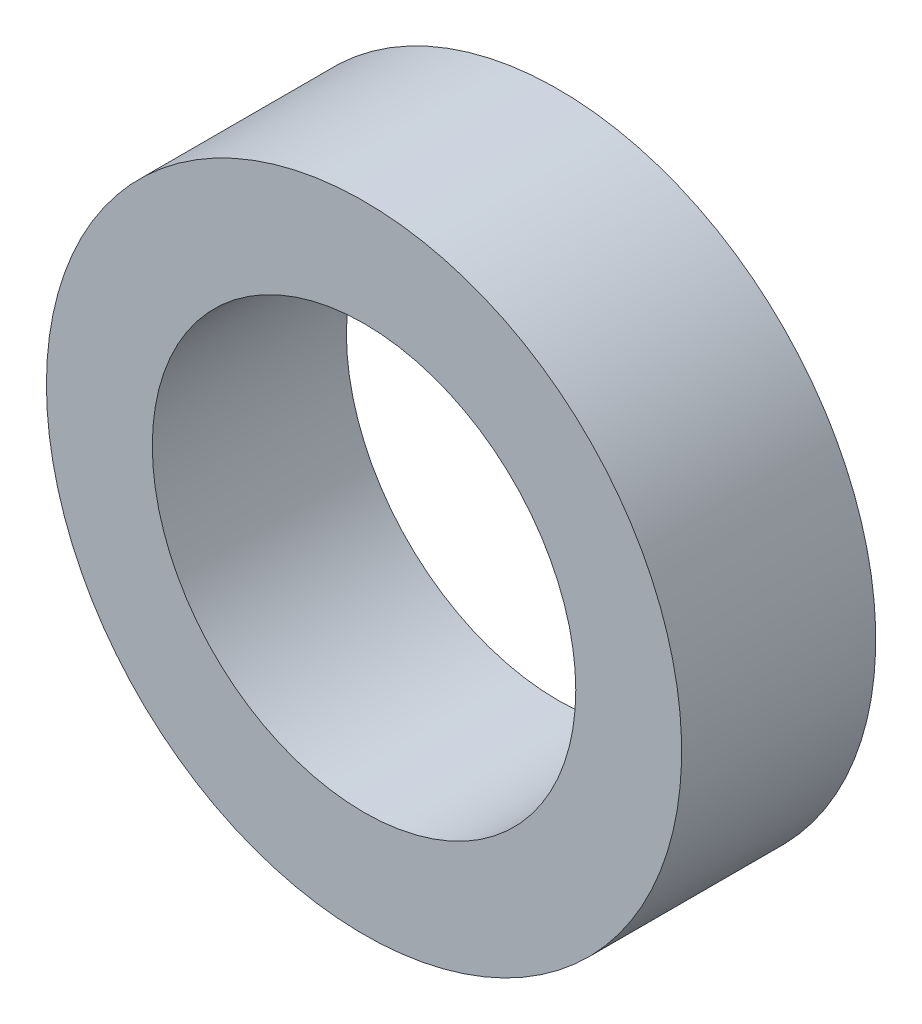
ISO-10303-21;
HEADER;
FILE_DESCRIPTION(('STEP AP214'),'2;1');
FILE_NAME('part.step','',(''),(''),'','','');
FILE_SCHEMA(('AUTOMOTIVE_DESIGN { 1 0 10303 214 1 1 1 1 }'));
ENDSEC;
DATA;
#1=APPLICATION_CONTEXT('core data for automotive mechanical design processes');
#2=APPLICATION_PROTOCOL_DEFINITION('international standard','automotive_design',2000,#1);
#3=PRODUCT_CONTEXT('',#1,'mechanical');
#4=PRODUCT('Part','Part','',(#3));
#5=PRODUCT_RELATED_PRODUCT_CATEGORY('part','',(#4));
#6=PRODUCT_DEFINITION_FORMATION('','',#4);
#7=PRODUCT_DEFINITION_CONTEXT('part definition',#1,'design');
#8=PRODUCT_DEFINITION('design','',#6,#7);
#9=PRODUCT_DEFINITION_SHAPE('','',#8);
#10=(LENGTH_UNIT() NAMED_UNIT(*) SI_UNIT(.MILLI.,.METRE.));
#11=(NAMED_UNIT(*) PLANE_ANGLE_UNIT() SI_UNIT($,.RADIAN.));
#12=(NAMED_UNIT(*) SI_UNIT($,.STERADIAN.) SOLID_ANGLE_UNIT());
#13=UNCERTAINTY_MEASURE_WITH_UNIT(LENGTH_MEASURE(1.E-05),#10,'distance_accuracy_value','');
#14=(GEOMETRIC_REPRESENTATION_CONTEXT(3) GLOBAL_UNCERTAINTY_ASSIGNED_CONTEXT((#13)) GLOBAL_UNIT_ASSIGNED_CONTEXT((#10,
#11,#12)) REPRESENTATION_CONTEXT('',''));
#15=CARTESIAN_POINT('',(0.,0.,0.));
#16=DIRECTION('',(0.,0.,1.));
#17=DIRECTION('',(1.,0.,0.));
#18=AXIS2_PLACEMENT_3D('',#15,#16,#17);
#19=CARTESIAN_POINT('',(0.,0.,5.5));
#20=DIRECTION('',(0.,0.,-1.));
#21=DIRECTION('',(-1.,0.,0.));
#22=AXIS2_PLACEMENT_3D('',#19,#20,#21);
#23=CYLINDRICAL_SURFACE('',#22,6.);
#24=CARTESIAN_POINT('',(0.,0.,0.));
#25=DIRECTION('',(0.,0.,-1.));
#26=DIRECTION('',(-1.,0.,0.));
#27=AXIS2_PLACEMENT_3D('',#24,#25,#26);
#28=CIRCLE('',#27,6.);
#29=CARTESIAN_POINT('',(-6.,0.,0.));
#30=VERTEX_POINT('',#29);
#31=EDGE_CURVE('E27',#30,#30,#28,.T.);
#32=ORIENTED_EDGE('',*,*,#31,.T.);
#33=EDGE_LOOP('',(#32));
#34=FACE_BOUND('',#33,.T.);
#35=CARTESIAN_POINT('',(0.,0.,5.5));
#36=DIRECTION('',(0.,0.,-1.));
#37=DIRECTION('',(-1.,0.,0.));
#38=AXIS2_PLACEMENT_3D('',#35,#36,#37);
#39=CIRCLE('',#38,6.);
#40=CARTESIAN_POINT('',(-6.,0.,5.5));
#41=VERTEX_POINT('',#40);
#42=EDGE_CURVE('E18',#41,#41,#39,.T.);
#43=ORIENTED_EDGE('',*,*,#42,.F.);
#44=EDGE_LOOP('',(#43));
#45=FACE_BOUND('',#44,.T.);
#46=ADVANCED_FACE('F15',(#34,#45),#23,.F.);
#47=CARTESIAN_POINT('',(0.,0.,5.5));
#48=DIRECTION('',(0.,0.,1.));
#49=DIRECTION('',(1.,0.,0.));
#50=AXIS2_PLACEMENT_3D('',#47,#48,#49);
#51=PLANE('',#50);
#52=ORIENTED_EDGE('',*,*,#42,.T.);
#53=EDGE_LOOP('',(#52));
#54=FACE_BOUND('',#53,.T.);
#55=CARTESIAN_POINT('',(0.,0.,5.5));
#56=DIRECTION('',(0.,0.,-1.));
#57=DIRECTION('',(-1.,0.,0.));
#58=AXIS2_PLACEMENT_3D('',#55,#56,#57);
#59=CIRCLE('',#58,9.);
#60=CARTESIAN_POINT('',(-9.,0.,5.5));
#61=VERTEX_POINT('',#60);
#62=EDGE_CURVE('E22',#61,#61,#59,.T.);
#63=ORIENTED_EDGE('',*,*,#62,.F.);
#64=EDGE_LOOP('',(#63));
#65=FACE_BOUND('',#64,.T.);
#66=ADVANCED_FACE('F35',(#54,#65),#51,.T.);
#67=CARTESIAN_POINT('',(0.,0.,0.));
#68=DIRECTION('',(0.,0.,1.));
#69=DIRECTION('',(1.,0.,0.));
#70=AXIS2_PLACEMENT_3D('',#67,#68,#69);
#71=PLANE('',#70);
#72=ORIENTED_EDGE('',*,*,#31,.F.);
#73=EDGE_LOOP('',(#72));
#74=FACE_BOUND('',#73,.T.);
#75=CARTESIAN_POINT('',(0.,0.,0.));
#76=DIRECTION('',(0.,0.,-1.));
#77=DIRECTION('',(-1.,0.,0.));
#78=AXIS2_PLACEMENT_3D('',#75,#76,#77);
#79=CIRCLE('',#78,9.);
#80=CARTESIAN_POINT('',(-9.,0.,0.));
#81=VERTEX_POINT('',#80);
#82=EDGE_CURVE('E10',#81,#81,#79,.F.);
#83=ORIENTED_EDGE('',*,*,#82,.F.);
#84=EDGE_LOOP('',(#83));
#85=FACE_BOUND('',#84,.T.);
#86=ADVANCED_FACE('F43',(#74,#85),#71,.F.);
#87=CARTESIAN_POINT('',(0.,0.,5.5));
#88=DIRECTION('',(0.,0.,-1.));
#89=DIRECTION('',(-1.,0.,0.));
#90=AXIS2_PLACEMENT_3D('',#87,#88,#89);
#91=CYLINDRICAL_SURFACE('',#90,9.);
#92=ORIENTED_EDGE('',*,*,#82,.T.);
#93=EDGE_LOOP('',(#92));
#94=FACE_BOUND('',#93,.T.);
#95=ORIENTED_EDGE('',*,*,#62,.T.);
#96=EDGE_LOOP('',(#95));
#97=FACE_BOUND('',#96,.T.);
#98=ADVANCED_FACE('F44',(#94,#97),#91,.T.);
#99=CLOSED_SHELL('',(#46,#66,#86,#98));
#100=MANIFOLD_SOLID_BREP('B1',#99);
#101=ADVANCED_BREP_SHAPE_REPRESENTATION('',(#18,#100),#14);
#102=SHAPE_DEFINITION_REPRESENTATION(#9,#101);
ENDSEC;
END-ISO-10303-21;
